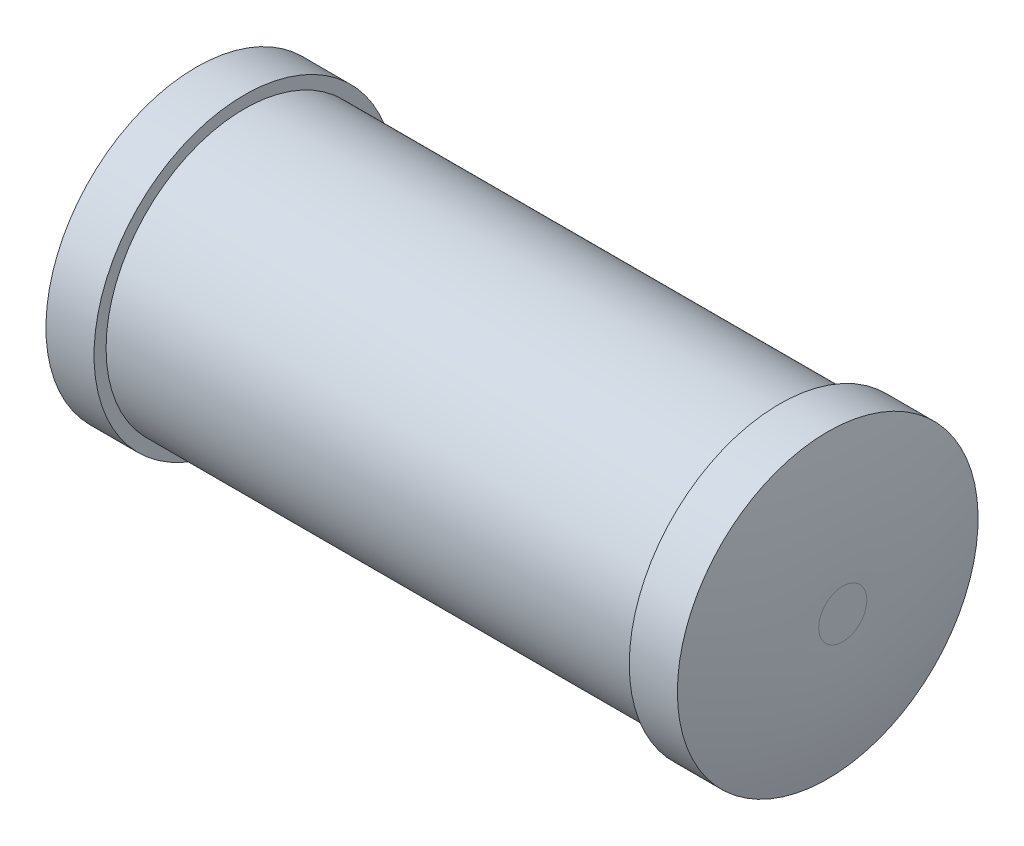
ISO-10303-21;
HEADER;
FILE_DESCRIPTION(('STEP AP214'),'2;1');
FILE_NAME('part.step','',(''),(''),'','','');
FILE_SCHEMA(('AUTOMOTIVE_DESIGN { 1 0 10303 214 1 1 1 1 }'));
ENDSEC;
DATA;
#1=APPLICATION_CONTEXT('core data for automotive mechanical design processes');
#2=APPLICATION_PROTOCOL_DEFINITION('international standard','automotive_design',2000,#1);
#3=PRODUCT_CONTEXT('',#1,'mechanical');
#4=PRODUCT('Part','Part','',(#3));
#5=PRODUCT_RELATED_PRODUCT_CATEGORY('part','',(#4));
#6=PRODUCT_DEFINITION_FORMATION('','',#4);
#7=PRODUCT_DEFINITION_CONTEXT('part definition',#1,'design');
#8=PRODUCT_DEFINITION('design','',#6,#7);
#9=PRODUCT_DEFINITION_SHAPE('','',#8);
#10=(LENGTH_UNIT() NAMED_UNIT(*) SI_UNIT(.MILLI.,.METRE.));
#11=(NAMED_UNIT(*) PLANE_ANGLE_UNIT() SI_UNIT($,.RADIAN.));
#12=(NAMED_UNIT(*) SI_UNIT($,.STERADIAN.) SOLID_ANGLE_UNIT());
#13=UNCERTAINTY_MEASURE_WITH_UNIT(LENGTH_MEASURE(1.E-05),#10,'distance_accuracy_value','');
#14=(GEOMETRIC_REPRESENTATION_CONTEXT(3) GLOBAL_UNCERTAINTY_ASSIGNED_CONTEXT((#13)) GLOBAL_UNIT_ASSIGNED_CONTEXT((#10,
#11,#12)) REPRESENTATION_CONTEXT('',''));
#15=CARTESIAN_POINT('',(0.,0.,0.));
#16=DIRECTION('',(0.,0.,1.));
#17=DIRECTION('',(1.,0.,0.));
#18=AXIS2_PLACEMENT_3D('',#15,#16,#17);
#19=CARTESIAN_POINT('',(-5.5,0.,0.));
#20=DIRECTION('',(1.,0.,0.));
#21=DIRECTION('',(0.,0.,-1.));
#22=AXIS2_PLACEMENT_3D('',#19,#20,#21);
#23=PLANE('',#22);
#24=CARTESIAN_POINT('',(-5.49999999999531,0.,0.));
#25=DIRECTION('',(1.,0.,0.));
#26=DIRECTION('',(0.,1.,0.));
#27=AXIS2_PLACEMENT_3D('',#24,#25,#26);
#28=CIRCLE('',#27,0.400000000038999);
#29=CARTESIAN_POINT('',(-5.49999999999531,0.400000000038999,0.));
#30=VERTEX_POINT('',#29);
#31=EDGE_CURVE('E81',#30,#30,#28,.F.);
#32=ORIENTED_EDGE('',*,*,#31,.T.);
#33=EDGE_LOOP('',(#32));
#34=FACE_BOUND('',#33,.T.);
#35=ADVANCED_FACE('F15',(#34),#23,.F.);
#36=CARTESIAN_POINT('',(5.5,0.,0.));
#37=DIRECTION('',(1.,0.,0.));
#38=DIRECTION('',(0.,0.,-1.));
#39=AXIS2_PLACEMENT_3D('',#36,#37,#38);
#40=PLANE('',#39);
#41=CARTESIAN_POINT('',(5.49999999999531,0.,0.));
#42=DIRECTION('',(-1.,0.,0.));
#43=DIRECTION('',(0.,1.,0.));
#44=AXIS2_PLACEMENT_3D('',#41,#42,#43);
#45=CIRCLE('',#44,0.400000000039);
#46=CARTESIAN_POINT('',(5.49999999999531,0.400000000039,0.));
#47=VERTEX_POINT('',#46);
#48=EDGE_CURVE('E48',#47,#47,#45,.F.);
#49=ORIENTED_EDGE('',*,*,#48,.T.);
#50=EDGE_LOOP('',(#49));
#51=FACE_BOUND('',#50,.T.);
#52=ADVANCED_FACE('F93',(#51),#40,.T.);
#53=CARTESIAN_POINT('',(3.4450769533,0.399990838893,0.));
#54=DIRECTION('',(0.,0.,1.));
#55=DIRECTION('',(1.,0.,0.));
#56=AXIS2_PLACEMENT_3D('',#53,#54,#55);
#57=CIRCLE('',#56,8.9450769533);
#58=TRIMMED_CURVE('',#57,(PARAMETER_VALUE(-0.0447312260412671)),
(PARAMETER_VALUE(3.18632387963106)),.T.,.PARAMETER.);
#59=CARTESIAN_POINT('',(0.,0.,0.));
#60=DIRECTION('',(-1.,0.,0.));
#61=AXIS1_PLACEMENT('',#59,#60);
#62=SURFACE_OF_REVOLUTION('',#58,#61);
#63=ORIENTED_EDGE('',*,*,#31,.F.);
#64=EDGE_LOOP('',(#63));
#65=FACE_BOUND('',#64,.T.);
#66=CARTESIAN_POINT('',(-5.250000000007,0.,0.));
#67=DIRECTION('',(1.,0.,0.));
#68=DIRECTION('',(0.,0.,-1.));
#69=AXIS2_PLACEMENT_3D('',#66,#67,#68);
#70=CIRCLE('',#69,2.5);
#71=CARTESIAN_POINT('',(-5.250000000007,0.,-2.5));
#72=VERTEX_POINT('',#71);
#73=EDGE_CURVE('E43',#72,#72,#70,.T.);
#74=ORIENTED_EDGE('',*,*,#73,.F.);
#75=EDGE_LOOP('',(#74));
#76=FACE_BOUND('',#75,.T.);
#77=ADVANCED_FACE('F61',(#65,#76),#62,.T.);
#78=CARTESIAN_POINT('',(-3.4450769533,0.399990838893,0.));
#79=DIRECTION('',(0.,0.,1.));
#80=DIRECTION('',(1.,0.,0.));
#81=AXIS2_PLACEMENT_3D('',#78,#79,#80);
#82=CIRCLE('',#81,8.9450769533);
#83=TRIMMED_CURVE('',#82,(PARAMETER_VALUE(-0.0447312260412671)),
(PARAMETER_VALUE(3.18632387963106)),.T.,.PARAMETER.);
#84=CARTESIAN_POINT('',(0.,0.,0.));
#85=DIRECTION('',(-1.,0.,0.));
#86=AXIS1_PLACEMENT('',#84,#85);
#87=SURFACE_OF_REVOLUTION('',#83,#86);
#88=CARTESIAN_POINT('',(5.250000000007,0.,0.));
#89=DIRECTION('',(-1.,0.,0.));
#90=DIRECTION('',(0.,0.,1.));
#91=AXIS2_PLACEMENT_3D('',#88,#89,#90);
#92=CIRCLE('',#91,2.5);
#93=CARTESIAN_POINT('',(5.250000000007,0.,2.5));
#94=VERTEX_POINT('',#93);
#95=EDGE_CURVE('E39',#94,#94,#92,.T.);
#96=ORIENTED_EDGE('',*,*,#95,.F.);
#97=EDGE_LOOP('',(#96));
#98=FACE_BOUND('',#97,.T.);
#99=ORIENTED_EDGE('',*,*,#48,.F.);
#100=EDGE_LOOP('',(#99));
#101=FACE_BOUND('',#100,.T.);
#102=ADVANCED_FACE('F56',(#98,#101),#87,.T.);
#103=CARTESIAN_POINT('',(-5.25,0.,0.));
#104=DIRECTION('',(1.,0.,0.));
#105=DIRECTION('',(0.,0.,-1.));
#106=AXIS2_PLACEMENT_3D('',#103,#104,#105);
#107=CYLINDRICAL_SURFACE('',#106,2.5);
#108=CARTESIAN_POINT('',(-4.45,0.,0.));
#109=DIRECTION('',(1.,0.,0.));
#110=DIRECTION('',(0.,0.,-1.));
#111=AXIS2_PLACEMENT_3D('',#108,#109,#110);
#112=CIRCLE('',#111,2.5);
#113=CARTESIAN_POINT('',(-4.45,0.,-2.5));
#114=VERTEX_POINT('',#113);
#115=EDGE_CURVE('E19',#114,#114,#112,.T.);
#116=ORIENTED_EDGE('',*,*,#115,.F.);
#117=EDGE_LOOP('',(#116));
#118=FACE_BOUND('',#117,.T.);
#119=ORIENTED_EDGE('',*,*,#73,.T.);
#120=EDGE_LOOP('',(#119));
#121=FACE_BOUND('',#120,.T.);
#122=ADVANCED_FACE('F60',(#118,#121),#107,.T.);
#123=CARTESIAN_POINT('',(5.25,0.,0.));
#124=DIRECTION('',(-1.,0.,0.));
#125=DIRECTION('',(0.,0.,1.));
#126=AXIS2_PLACEMENT_3D('',#123,#124,#125);
#127=CYLINDRICAL_SURFACE('',#126,2.5);
#128=CARTESIAN_POINT('',(4.45,0.,0.));
#129=DIRECTION('',(-1.,0.,0.));
#130=DIRECTION('',(0.,0.,1.));
#131=AXIS2_PLACEMENT_3D('',#128,#129,#130);
#132=CIRCLE('',#131,2.5);
#133=CARTESIAN_POINT('',(4.45,0.,2.5));
#134=VERTEX_POINT('',#133);
#135=EDGE_CURVE('E28',#134,#134,#132,.F.);
#136=ORIENTED_EDGE('',*,*,#135,.T.);
#137=EDGE_LOOP('',(#136));
#138=FACE_BOUND('',#137,.T.);
#139=ORIENTED_EDGE('',*,*,#95,.T.);
#140=EDGE_LOOP('',(#139));
#141=FACE_BOUND('',#140,.T.);
#142=ADVANCED_FACE('F122',(#138,#141),#127,.T.);
#143=CARTESIAN_POINT('',(-4.45,0.,0.));
#144=DIRECTION('',(1.,0.,0.));
#145=DIRECTION('',(0.,0.,-1.));
#146=AXIS2_PLACEMENT_3D('',#143,#144,#145);
#147=PLANE('',#146);
#148=CARTESIAN_POINT('',(-4.45,0.,0.));
#149=DIRECTION('',(1.,0.,0.));
#150=DIRECTION('',(0.,0.,-1.));
#151=AXIS2_PLACEMENT_3D('',#148,#149,#150);
#152=CIRCLE('',#151,2.3);
#153=CARTESIAN_POINT('',(-4.45,0.,-2.3));
#154=VERTEX_POINT('',#153);
#155=EDGE_CURVE('E23',#154,#154,#152,.T.);
#156=ORIENTED_EDGE('',*,*,#155,.F.);
#157=EDGE_LOOP('',(#156));
#158=FACE_BOUND('',#157,.T.);
#159=ORIENTED_EDGE('',*,*,#115,.T.);
#160=EDGE_LOOP('',(#159));
#161=FACE_BOUND('',#160,.T.);
#162=ADVANCED_FACE('F116',(#158,#161),#147,.T.);
#163=CARTESIAN_POINT('',(4.45,0.,0.));
#164=DIRECTION('',(1.,0.,0.));
#165=DIRECTION('',(0.,0.,-1.));
#166=AXIS2_PLACEMENT_3D('',#163,#164,#165);
#167=PLANE('',#166);
#168=CARTESIAN_POINT('',(4.45,0.,0.));
#169=DIRECTION('',(1.,0.,0.));
#170=DIRECTION('',(0.,0.,-1.));
#171=AXIS2_PLACEMENT_3D('',#168,#169,#170);
#172=CIRCLE('',#171,2.3);
#173=CARTESIAN_POINT('',(4.45,0.,-2.3));
#174=VERTEX_POINT('',#173);
#175=EDGE_CURVE('E10',#174,#174,#172,.F.);
#176=ORIENTED_EDGE('',*,*,#175,.F.);
#177=EDGE_LOOP('',(#176));
#178=FACE_BOUND('',#177,.T.);
#179=ORIENTED_EDGE('',*,*,#135,.F.);
#180=EDGE_LOOP('',(#179));
#181=FACE_BOUND('',#180,.T.);
#182=ADVANCED_FACE('F111',(#178,#181),#167,.F.);
#183=CARTESIAN_POINT('',(-4.45,0.,0.));
#184=DIRECTION('',(1.,0.,0.));
#185=DIRECTION('',(0.,0.,-1.));
#186=AXIS2_PLACEMENT_3D('',#183,#184,#185);
#187=CYLINDRICAL_SURFACE('',#186,2.3);
#188=ORIENTED_EDGE('',*,*,#175,.T.);
#189=EDGE_LOOP('',(#188));
#190=FACE_BOUND('',#189,.T.);
#191=ORIENTED_EDGE('',*,*,#155,.T.);
#192=EDGE_LOOP('',(#191));
#193=FACE_BOUND('',#192,.T.);
#194=ADVANCED_FACE('F109',(#190,#193),#187,.T.);
#195=CLOSED_SHELL('',(#35,#52,#77,#102,#122,#142,#162,#182,#194));
#196=MANIFOLD_SOLID_BREP('B1',#195);
#197=ADVANCED_BREP_SHAPE_REPRESENTATION('',(#18,#196),#14);
#198=SHAPE_DEFINITION_REPRESENTATION(#9,#197);
ENDSEC;
END-ISO-10303-21;
